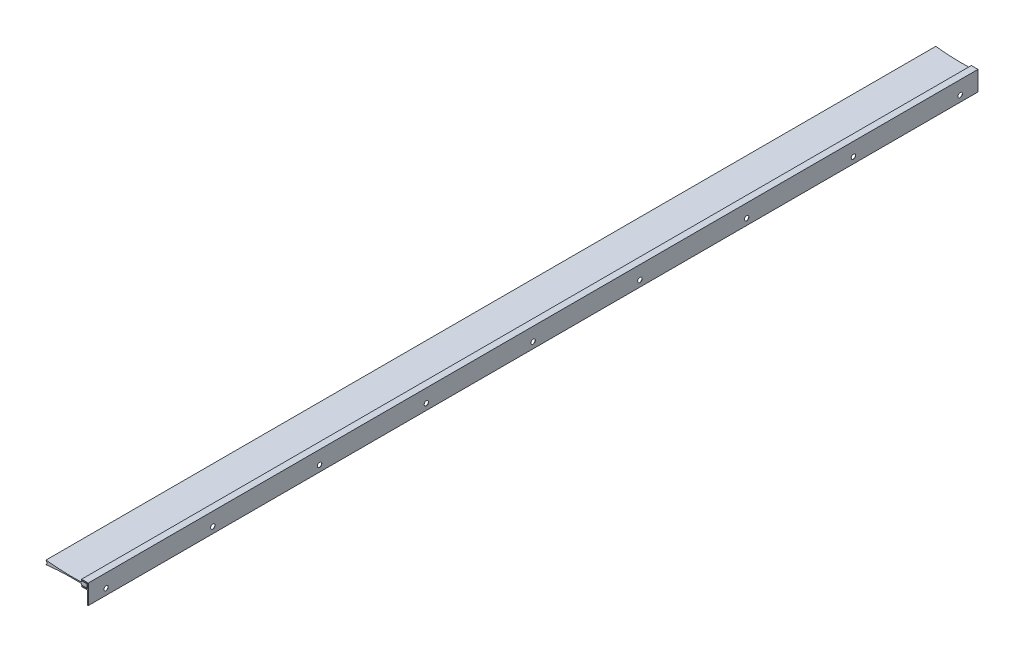
ISO-10303-21;
HEADER;
FILE_DESCRIPTION(('STEP AP214'),'2;1');
FILE_NAME('part.step','',(''),(''),'','','');
FILE_SCHEMA(('AUTOMOTIVE_DESIGN { 1 0 10303 214 1 1 1 1 }'));
ENDSEC;
DATA;
#1=APPLICATION_CONTEXT('core data for automotive mechanical design processes');
#2=APPLICATION_PROTOCOL_DEFINITION('international standard','automotive_design',2000,#1);
#3=PRODUCT_CONTEXT('',#1,'mechanical');
#4=PRODUCT('Part','Part','',(#3));
#5=PRODUCT_RELATED_PRODUCT_CATEGORY('part','',(#4));
#6=PRODUCT_DEFINITION_FORMATION('','',#4);
#7=PRODUCT_DEFINITION_CONTEXT('part definition',#1,'design');
#8=PRODUCT_DEFINITION('design','',#6,#7);
#9=PRODUCT_DEFINITION_SHAPE('','',#8);
#10=(LENGTH_UNIT() NAMED_UNIT(*) SI_UNIT(.MILLI.,.METRE.));
#11=(NAMED_UNIT(*) PLANE_ANGLE_UNIT() SI_UNIT($,.RADIAN.));
#12=(NAMED_UNIT(*) SI_UNIT($,.STERADIAN.) SOLID_ANGLE_UNIT());
#13=UNCERTAINTY_MEASURE_WITH_UNIT(LENGTH_MEASURE(1.E-05),#10,'distance_accuracy_value','');
#14=(GEOMETRIC_REPRESENTATION_CONTEXT(3) GLOBAL_UNCERTAINTY_ASSIGNED_CONTEXT((#13)) GLOBAL_UNIT_ASSIGNED_CONTEXT((#10,
#11,#12)) REPRESENTATION_CONTEXT('',''));
#15=CARTESIAN_POINT('',(0.,0.,0.));
#16=DIRECTION('',(0.,0.,1.));
#17=DIRECTION('',(1.,0.,0.));
#18=AXIS2_PLACEMENT_3D('',#15,#16,#17);
#19=CARTESIAN_POINT('',(0.,0.,-500.));
#20=DIRECTION('',(0.,0.,-1.));
#21=DIRECTION('',(-1.,0.,0.));
#22=AXIS2_PLACEMENT_3D('',#19,#20,#21);
#23=PLANE('',#22);
#24=DIRECTION('',(0.,-1.,0.));
#25=VECTOR('',#24,1.);
#26=CARTESIAN_POINT('',(0.,5.7,-500.));
#27=LINE('',#26,#25);
#28=CARTESIAN_POINT('',(0.,5.7,-500.));
#29=VERTEX_POINT('',#28);
#30=CARTESIAN_POINT('',(0.,4.29999999999997,-500.));
#31=VERTEX_POINT('',#30);
#32=EDGE_CURVE('E58',#29,#31,#27,.T.);
#33=ORIENTED_EDGE('',*,*,#32,.F.);
#34=DIRECTION('',(-1.,0.,0.));
#35=VECTOR('',#34,1.);
#36=CARTESIAN_POINT('',(0.,5.7,-500.));
#37=LINE('',#36,#35);
#38=CARTESIAN_POINT('',(6.,5.7,-500.));
#39=VERTEX_POINT('',#38);
#40=EDGE_CURVE('E150',#39,#29,#37,.T.);
#41=ORIENTED_EDGE('',*,*,#40,.F.);
#42=DIRECTION('',(0.,1.,0.));
#43=VECTOR('',#42,1.);
#44=CARTESIAN_POINT('',(6.,5.7,-500.));
#45=LINE('',#44,#43);
#46=CARTESIAN_POINT('',(6.,1.5,-500.));
#47=VERTEX_POINT('',#46);
#48=EDGE_CURVE('E154',#47,#39,#45,.T.);
#49=ORIENTED_EDGE('',*,*,#48,.F.);
#50=DIRECTION('',(1.,0.,0.));
#51=VECTOR('',#50,1.);
#52=CARTESIAN_POINT('',(0.,1.5,-500.));
#53=LINE('',#52,#51);
#54=CARTESIAN_POINT('',(0.,1.5,-500.));
#55=VERTEX_POINT('',#54);
#56=EDGE_CURVE('E158',#55,#47,#53,.T.);
#57=ORIENTED_EDGE('',*,*,#56,.F.);
#58=DIRECTION('',(0.,-1.,0.));
#59=VECTOR('',#58,1.);
#60=CARTESIAN_POINT('',(0.,2.9,-500.));
#61=LINE('',#60,#59);
#62=CARTESIAN_POINT('',(0.,2.90000000000001,-500.));
#63=VERTEX_POINT('',#62);
#64=EDGE_CURVE('E162',#63,#55,#61,.T.);
#65=ORIENTED_EDGE('',*,*,#64,.F.);
#66=CARTESIAN_POINT('',(-10.014858939479,-256.907048788947,-500.));
#67=DIRECTION('',(0.,0.,-1.));
#68=DIRECTION('',(-1.,0.,0.));
#69=AXIS2_PLACEMENT_3D('',#66,#67,#68);
#70=CIRCLE('',#69,260.);
#71=CARTESIAN_POINT('',(-40.,1.3581082020428,-500.));
#72=VERTEX_POINT('',#71);
#73=EDGE_CURVE('E166',#72,#63,#70,.T.);
#74=ORIENTED_EDGE('',*,*,#73,.F.);
#75=DIRECTION('',(-0.556086767877966,-0.831124242572094,0.));
#76=VECTOR('',#75,1.);
#77=CARTESIAN_POINT('',(-38.5,3.59999999999999,-500.));
#78=LINE('',#77,#76);
#79=CARTESIAN_POINT('',(-38.5,3.59999999999999,-500.));
#80=VERTEX_POINT('',#79);
#81=EDGE_CURVE('E96',#80,#72,#78,.T.);
#82=ORIENTED_EDGE('',*,*,#81,.F.);
#83=DIRECTION('',(0.556086767877967,-0.831124242572094,0.));
#84=VECTOR('',#83,1.);
#85=CARTESIAN_POINT('',(-40.,5.84189179795719,-500.));
#86=LINE('',#85,#84);
#87=CARTESIAN_POINT('',(-40.,5.84189179795719,-500.));
#88=VERTEX_POINT('',#87);
#89=EDGE_CURVE('E101',#88,#80,#86,.T.);
#90=ORIENTED_EDGE('',*,*,#89,.F.);
#91=CARTESIAN_POINT('',(-10.014858939479,264.107048788947,-500.));
#92=DIRECTION('',(0.,0.,-1.));
#93=DIRECTION('',(-1.,0.,0.));
#94=AXIS2_PLACEMENT_3D('',#91,#92,#93);
#95=CIRCLE('',#94,260.);
#96=EDGE_CURVE('E131',#31,#88,#95,.T.);
#97=ORIENTED_EDGE('',*,*,#96,.F.);
#98=EDGE_LOOP('',(#33,#41,#49,#57,#65,#74,#82,#90,#97));
#99=FACE_BOUND('',#98,.T.);
#100=ADVANCED_FACE('F50',(#99),#23,.T.);
#101=CARTESIAN_POINT('',(-10.014858939479,264.107048788947,500.));
#102=DIRECTION('',(0.,0.,-1.));
#103=DIRECTION('',(-1.,0.,0.));
#104=AXIS2_PLACEMENT_3D('',#101,#102,#103);
#105=PLANE('',#104);
#106=DIRECTION('',(0.,-1.,0.));
#107=VECTOR('',#106,1.);
#108=CARTESIAN_POINT('',(0.,5.7,500.));
#109=LINE('',#108,#107);
#110=CARTESIAN_POINT('',(0.,5.7,500.));
#111=VERTEX_POINT('',#110);
#112=CARTESIAN_POINT('',(0.,4.29999999999997,500.));
#113=VERTEX_POINT('',#112);
#114=EDGE_CURVE('E141',#111,#113,#109,.T.);
#115=ORIENTED_EDGE('',*,*,#114,.T.);
#116=CARTESIAN_POINT('',(-10.014858939479,264.107048788947,500.));
#117=DIRECTION('',(0.,0.,-1.));
#118=DIRECTION('',(-1.,0.,0.));
#119=AXIS2_PLACEMENT_3D('',#116,#117,#118);
#120=CIRCLE('',#119,260.);
#121=CARTESIAN_POINT('',(-40.,5.84189179795719,500.));
#122=VERTEX_POINT('',#121);
#123=EDGE_CURVE('E129',#113,#122,#120,.T.);
#124=ORIENTED_EDGE('',*,*,#123,.T.);
#125=DIRECTION('',(0.556086767877967,-0.831124242572094,0.));
#126=VECTOR('',#125,1.);
#127=CARTESIAN_POINT('',(-40.,5.84189179795719,500.));
#128=LINE('',#127,#126);
#129=CARTESIAN_POINT('',(-38.5,3.59999999999999,500.));
#130=VERTEX_POINT('',#129);
#131=EDGE_CURVE('E133',#122,#130,#128,.T.);
#132=ORIENTED_EDGE('',*,*,#131,.T.);
#133=DIRECTION('',(-0.556086767877966,-0.831124242572094,0.));
#134=VECTOR('',#133,1.);
#135=CARTESIAN_POINT('',(-38.5,3.59999999999999,500.));
#136=LINE('',#135,#134);
#137=CARTESIAN_POINT('',(-40.,1.3581082020428,500.));
#138=VERTEX_POINT('',#137);
#139=EDGE_CURVE('E137',#130,#138,#136,.T.);
#140=ORIENTED_EDGE('',*,*,#139,.T.);
#141=CARTESIAN_POINT('',(-10.014858939479,-256.907048788947,500.));
#142=DIRECTION('',(0.,0.,-1.));
#143=DIRECTION('',(1.,0.,0.));
#144=AXIS2_PLACEMENT_3D('',#141,#142,#143);
#145=CIRCLE('',#144,260.);
#146=CARTESIAN_POINT('',(0.,2.9,500.));
#147=VERTEX_POINT('',#146);
#148=EDGE_CURVE('E184',#138,#147,#145,.T.);
#149=ORIENTED_EDGE('',*,*,#148,.T.);
#150=DIRECTION('',(0.,-1.,0.));
#151=VECTOR('',#150,1.);
#152=CARTESIAN_POINT('',(0.,2.9,500.));
#153=LINE('',#152,#151);
#154=CARTESIAN_POINT('',(0.,1.5,500.));
#155=VERTEX_POINT('',#154);
#156=EDGE_CURVE('E189',#147,#155,#153,.T.);
#157=ORIENTED_EDGE('',*,*,#156,.T.);
#158=DIRECTION('',(1.,0.,0.));
#159=VECTOR('',#158,1.);
#160=CARTESIAN_POINT('',(0.,1.5,500.));
#161=LINE('',#160,#159);
#162=CARTESIAN_POINT('',(6.,1.5,500.));
#163=VERTEX_POINT('',#162);
#164=EDGE_CURVE('E193',#155,#163,#161,.T.);
#165=ORIENTED_EDGE('',*,*,#164,.T.);
#166=DIRECTION('',(0.,1.,0.));
#167=VECTOR('',#166,1.);
#168=CARTESIAN_POINT('',(6.,5.7,500.));
#169=LINE('',#168,#167);
#170=CARTESIAN_POINT('',(6.,5.7,500.));
#171=VERTEX_POINT('',#170);
#172=EDGE_CURVE('E196',#163,#171,#169,.T.);
#173=ORIENTED_EDGE('',*,*,#172,.T.);
#174=DIRECTION('',(-1.,0.,0.));
#175=VECTOR('',#174,1.);
#176=CARTESIAN_POINT('',(0.,5.7,500.));
#177=LINE('',#176,#175);
#178=EDGE_CURVE('E147',#171,#111,#177,.T.);
#179=ORIENTED_EDGE('',*,*,#178,.T.);
#180=EDGE_LOOP('',(#115,#124,#132,#140,#149,#157,#165,#173,#179));
#181=FACE_BOUND('',#180,.T.);
#182=ADVANCED_FACE('F139',(#181),#105,.F.);
#183=CARTESIAN_POINT('',(-10.014858939479,264.107048788947,-546.218008560895));
#184=DIRECTION('',(0.,0.,1.));
#185=DIRECTION('',(1.,0.,0.));
#186=AXIS2_PLACEMENT_3D('',#183,#184,#185);
#187=CYLINDRICAL_SURFACE('',#186,260.);
#188=DIRECTION('',(0.,0.,1.));
#189=VECTOR('',#188,1.);
#190=CARTESIAN_POINT('',(0.,4.29999999999997,-546.218008560895));
#191=LINE('',#190,#189);
#192=EDGE_CURVE('E12',#31,#113,#191,.T.);
#193=ORIENTED_EDGE('',*,*,#192,.F.);
#194=ORIENTED_EDGE('',*,*,#96,.T.);
#195=DIRECTION('',(0.,0.,1.));
#196=VECTOR('',#195,1.);
#197=CARTESIAN_POINT('',(-40.,5.84189179795719,-546.218008560895));
#198=LINE('',#197,#196);
#199=EDGE_CURVE('E126',#88,#122,#198,.T.);
#200=ORIENTED_EDGE('',*,*,#199,.T.);
#201=ORIENTED_EDGE('',*,*,#123,.F.);
#202=EDGE_LOOP('',(#193,#194,#200,#201));
#203=FACE_BOUND('',#202,.T.);
#204=ADVANCED_FACE('F127',(#203),#187,.F.);
#205=CARTESIAN_POINT('',(-40.,5.84189179795719,-546.218008560895));
#206=DIRECTION('',(-0.831124242572094,-0.556086767877967,0.));
#207=DIRECTION('',(0.556086767877967,-0.831124242572094,0.));
#208=AXIS2_PLACEMENT_3D('',#205,#206,#207);
#209=PLANE('',#208);
#210=ORIENTED_EDGE('',*,*,#199,.F.);
#211=ORIENTED_EDGE('',*,*,#89,.T.);
#212=DIRECTION('',(0.,0.,1.));
#213=VECTOR('',#212,1.);
#214=CARTESIAN_POINT('',(-38.5,3.59999999999999,-546.218008560895));
#215=LINE('',#214,#213);
#216=EDGE_CURVE('E121',#80,#130,#215,.T.);
#217=ORIENTED_EDGE('',*,*,#216,.T.);
#218=ORIENTED_EDGE('',*,*,#131,.F.);
#219=EDGE_LOOP('',(#210,#211,#217,#218));
#220=FACE_BOUND('',#219,.T.);
#221=ADVANCED_FACE('F134',(#220),#209,.T.);
#222=CARTESIAN_POINT('',(-38.5,3.59999999999999,-546.218008560895));
#223=DIRECTION('',(-0.831124242572094,0.556086767877966,0.));
#224=DIRECTION('',(-0.556086767877966,-0.831124242572094,0.));
#225=AXIS2_PLACEMENT_3D('',#222,#223,#224);
#226=PLANE('',#225);
#227=ORIENTED_EDGE('',*,*,#216,.F.);
#228=ORIENTED_EDGE('',*,*,#81,.T.);
#229=DIRECTION('',(0.,0.,1.));
#230=VECTOR('',#229,1.);
#231=CARTESIAN_POINT('',(-40.,1.3581082020428,-546.218008560895));
#232=LINE('',#231,#230);
#233=EDGE_CURVE('E169',#72,#138,#232,.T.);
#234=ORIENTED_EDGE('',*,*,#233,.T.);
#235=ORIENTED_EDGE('',*,*,#139,.F.);
#236=EDGE_LOOP('',(#227,#228,#234,#235));
#237=FACE_BOUND('',#236,.T.);
#238=ADVANCED_FACE('F181',(#237),#226,.T.);
#239=CARTESIAN_POINT('',(-10.014858939479,-256.907048788947,-546.218008560895));
#240=DIRECTION('',(0.,0.,1.));
#241=DIRECTION('',(1.,0.,0.));
#242=AXIS2_PLACEMENT_3D('',#239,#240,#241);
#243=CYLINDRICAL_SURFACE('',#242,260.);
#244=ORIENTED_EDGE('',*,*,#233,.F.);
#245=ORIENTED_EDGE('',*,*,#73,.T.);
#246=DIRECTION('',(0.,0.,1.));
#247=VECTOR('',#246,1.);
#248=CARTESIAN_POINT('',(0.,2.9,-546.218008560895));
#249=LINE('',#248,#247);
#250=EDGE_CURVE('E165',#63,#147,#249,.T.);
#251=ORIENTED_EDGE('',*,*,#250,.T.);
#252=ORIENTED_EDGE('',*,*,#148,.F.);
#253=EDGE_LOOP('',(#244,#245,#251,#252));
#254=FACE_BOUND('',#253,.T.);
#255=ADVANCED_FACE('F185',(#254),#243,.F.);
#256=CARTESIAN_POINT('',(0.,2.9,-546.218008560895));
#257=DIRECTION('',(-1.,0.,0.));
#258=DIRECTION('',(0.,-1.,0.));
#259=AXIS2_PLACEMENT_3D('',#256,#257,#258);
#260=PLANE('',#259);
#261=ORIENTED_EDGE('',*,*,#250,.F.);
#262=ORIENTED_EDGE('',*,*,#64,.T.);
#263=DIRECTION('',(0.,0.,1.));
#264=VECTOR('',#263,1.);
#265=CARTESIAN_POINT('',(0.,1.5,-546.218008560895));
#266=LINE('',#265,#264);
#267=EDGE_CURVE('E161',#55,#155,#266,.T.);
#268=ORIENTED_EDGE('',*,*,#267,.T.);
#269=ORIENTED_EDGE('',*,*,#156,.F.);
#270=EDGE_LOOP('',(#261,#262,#268,#269));
#271=FACE_BOUND('',#270,.T.);
#272=ADVANCED_FACE('F225',(#271),#260,.T.);
#273=CARTESIAN_POINT('',(0.,1.5,-546.218008560895));
#274=DIRECTION('',(0.,-1.,0.));
#275=DIRECTION('',(0.,0.,-1.));
#276=AXIS2_PLACEMENT_3D('',#273,#274,#275);
#277=PLANE('',#276);
#278=ORIENTED_EDGE('',*,*,#267,.F.);
#279=ORIENTED_EDGE('',*,*,#56,.T.);
#280=DIRECTION('',(0.,0.,1.));
#281=VECTOR('',#280,1.);
#282=CARTESIAN_POINT('',(6.,1.5,-546.218008560895));
#283=LINE('',#282,#281);
#284=EDGE_CURVE('E157',#47,#163,#283,.T.);
#285=ORIENTED_EDGE('',*,*,#284,.T.);
#286=ORIENTED_EDGE('',*,*,#164,.F.);
#287=EDGE_LOOP('',(#278,#279,#285,#286));
#288=FACE_BOUND('',#287,.T.);
#289=ADVANCED_FACE('F223',(#288),#277,.T.);
#290=CARTESIAN_POINT('',(6.,5.7,-546.218008560895));
#291=DIRECTION('',(1.,0.,0.));
#292=DIRECTION('',(0.,0.,-1.));
#293=AXIS2_PLACEMENT_3D('',#290,#291,#292);
#294=PLANE('',#293);
#295=ORIENTED_EDGE('',*,*,#284,.F.);
#296=ORIENTED_EDGE('',*,*,#48,.T.);
#297=DIRECTION('',(0.,0.,1.));
#298=VECTOR('',#297,1.);
#299=CARTESIAN_POINT('',(6.,5.7,-546.218008560895));
#300=LINE('',#299,#298);
#301=EDGE_CURVE('E153',#39,#171,#300,.T.);
#302=ORIENTED_EDGE('',*,*,#301,.T.);
#303=ORIENTED_EDGE('',*,*,#172,.F.);
#304=EDGE_LOOP('',(#295,#296,#302,#303));
#305=FACE_BOUND('',#304,.T.);
#306=ADVANCED_FACE('F211',(#305),#294,.T.);
#307=CARTESIAN_POINT('',(0.,5.7,-546.218008560895));
#308=DIRECTION('',(0.,1.,0.));
#309=DIRECTION('',(0.,0.,1.));
#310=AXIS2_PLACEMENT_3D('',#307,#308,#309);
#311=PLANE('',#310);
#312=ORIENTED_EDGE('',*,*,#301,.F.);
#313=ORIENTED_EDGE('',*,*,#40,.T.);
#314=DIRECTION('',(0.,0.,1.));
#315=VECTOR('',#314,1.);
#316=CARTESIAN_POINT('',(0.,5.7,-546.218008560895));
#317=LINE('',#316,#315);
#318=EDGE_CURVE('E149',#29,#111,#317,.T.);
#319=ORIENTED_EDGE('',*,*,#318,.T.);
#320=ORIENTED_EDGE('',*,*,#178,.F.);
#321=EDGE_LOOP('',(#312,#313,#319,#320));
#322=FACE_BOUND('',#321,.T.);
#323=ADVANCED_FACE('F203',(#322),#311,.T.);
#324=CARTESIAN_POINT('',(0.,5.7,-546.218008560895));
#325=DIRECTION('',(-1.,0.,0.));
#326=DIRECTION('',(0.,-1.,0.));
#327=AXIS2_PLACEMENT_3D('',#324,#325,#326);
#328=PLANE('',#327);
#329=ORIENTED_EDGE('',*,*,#318,.F.);
#330=ORIENTED_EDGE('',*,*,#32,.T.);
#331=ORIENTED_EDGE('',*,*,#192,.T.);
#332=ORIENTED_EDGE('',*,*,#114,.F.);
#333=EDGE_LOOP('',(#329,#330,#331,#332));
#334=FACE_BOUND('',#333,.T.);
#335=ADVANCED_FACE('F205',(#334),#328,.T.);
#336=CLOSED_SHELL('',(#100,#182,#204,#221,#238,#255,#272,#289,#306,#323,#335));
#337=MANIFOLD_SOLID_BREP('B2',#336);
#338=CARTESIAN_POINT('',(0.,6.2,500.));
#339=DIRECTION('',(1.,0.,0.));
#340=DIRECTION('',(0.,0.,-1.));
#341=AXIS2_PLACEMENT_3D('',#338,#339,#340);
#342=PLANE('',#341);
#343=DIRECTION('',(0.,-1.,0.));
#344=VECTOR('',#343,1.);
#345=CARTESIAN_POINT('',(0.,6.2,-500.));
#346=LINE('',#345,#344);
#347=CARTESIAN_POINT('',(0.,7.2,-500.));
#348=VERTEX_POINT('',#347);
#349=CARTESIAN_POINT('',(0.,6.2,-500.));
#350=VERTEX_POINT('',#349);
#351=EDGE_CURVE('E455',#348,#350,#346,.T.);
#352=ORIENTED_EDGE('',*,*,#351,.T.);
#353=DIRECTION('',(0.,0.,-1.));
#354=VECTOR('',#353,1.);
#355=CARTESIAN_POINT('',(0.,6.2,500.));
#356=LINE('',#355,#354);
#357=CARTESIAN_POINT('',(0.,6.2,500.));
#358=VERTEX_POINT('',#357);
#359=EDGE_CURVE('E48',#358,#350,#356,.T.);
#360=ORIENTED_EDGE('',*,*,#359,.F.);
#361=DIRECTION('',(0.,-1.,0.));
#362=VECTOR('',#361,1.);
#363=CARTESIAN_POINT('',(0.,6.2,500.));
#364=LINE('',#363,#362);
#365=CARTESIAN_POINT('',(0.,7.2,500.));
#366=VERTEX_POINT('',#365);
#367=EDGE_CURVE('E474',#366,#358,#364,.T.);
#368=ORIENTED_EDGE('',*,*,#367,.F.);
#369=DIRECTION('',(0.,0.,-1.));
#370=VECTOR('',#369,1.);
#371=CARTESIAN_POINT('',(0.,7.2,500.));
#372=LINE('',#371,#370);
#373=EDGE_CURVE('E451',#366,#348,#372,.T.);
#374=ORIENTED_EDGE('',*,*,#373,.T.);
#375=EDGE_LOOP('',(#352,#360,#368,#374));
#376=FACE_BOUND('',#375,.T.);
#377=ADVANCED_FACE('F347',(#376),#342,.F.);
#378=CARTESIAN_POINT('',(6.5,6.2,500.));
#379=DIRECTION('',(0.,1.,0.));
#380=DIRECTION('',(-1.,0.,0.));
#381=AXIS2_PLACEMENT_3D('',#378,#379,#380);
#382=PLANE('',#381);
#383=DIRECTION('',(1.,0.,0.));
#384=VECTOR('',#383,1.);
#385=CARTESIAN_POINT('',(6.5,6.2,-500.));
#386=LINE('',#385,#384);
#387=CARTESIAN_POINT('',(6.5,6.2,-500.));
#388=VERTEX_POINT('',#387);
#389=EDGE_CURVE('E458',#350,#388,#386,.T.);
#390=ORIENTED_EDGE('',*,*,#389,.T.);
#391=DIRECTION('',(0.,0.,-1.));
#392=VECTOR('',#391,1.);
#393=CARTESIAN_POINT('',(6.5,6.2,500.));
#394=LINE('',#393,#392);
#395=CARTESIAN_POINT('',(6.5,6.2,500.));
#396=VERTEX_POINT('',#395);
#397=EDGE_CURVE('E355',#396,#388,#394,.T.);
#398=ORIENTED_EDGE('',*,*,#397,.F.);
#399=DIRECTION('',(1.,0.,0.));
#400=VECTOR('',#399,1.);
#401=CARTESIAN_POINT('',(6.5,6.2,500.));
#402=LINE('',#401,#400);
#403=EDGE_CURVE('E412',#358,#396,#402,.T.);
#404=ORIENTED_EDGE('',*,*,#403,.F.);
#405=ORIENTED_EDGE('',*,*,#359,.T.);
#406=EDGE_LOOP('',(#390,#398,#404,#405));
#407=FACE_BOUND('',#406,.T.);
#408=ADVANCED_FACE('F607',(#407),#382,.F.);
#409=CARTESIAN_POINT('',(6.5,1.,500.));
#410=DIRECTION('',(1.,0.,0.));
#411=DIRECTION('',(0.,0.,-1.));
#412=AXIS2_PLACEMENT_3D('',#409,#410,#411);
#413=PLANE('',#412);
#414=DIRECTION('',(0.,-1.,0.));
#415=VECTOR('',#414,1.);
#416=CARTESIAN_POINT('',(6.5,1.,-500.));
#417=LINE('',#416,#415);
#418=CARTESIAN_POINT('',(6.5,1.,-500.));
#419=VERTEX_POINT('',#418);
#420=EDGE_CURVE('E461',#388,#419,#417,.T.);
#421=ORIENTED_EDGE('',*,*,#420,.T.);
#422=DIRECTION('',(0.,0.,-1.));
#423=VECTOR('',#422,1.);
#424=CARTESIAN_POINT('',(6.5,1.,500.));
#425=LINE('',#424,#423);
#426=CARTESIAN_POINT('',(6.5,1.,500.));
#427=VERTEX_POINT('',#426);
#428=EDGE_CURVE('E487',#427,#419,#425,.T.);
#429=ORIENTED_EDGE('',*,*,#428,.F.);
#430=DIRECTION('',(0.,-1.,0.));
#431=VECTOR('',#430,1.);
#432=CARTESIAN_POINT('',(6.5,1.,500.));
#433=LINE('',#432,#431);
#434=EDGE_CURVE('E495',#396,#427,#433,.T.);
#435=ORIENTED_EDGE('',*,*,#434,.F.);
#436=ORIENTED_EDGE('',*,*,#397,.T.);
#437=EDGE_LOOP('',(#421,#429,#435,#436));
#438=FACE_BOUND('',#437,.T.);
#439=ADVANCED_FACE('F493',(#438),#413,.F.);
#440=CARTESIAN_POINT('',(0.,1.,500.));
#441=DIRECTION('',(0.,-1.,0.));
#442=DIRECTION('',(0.,0.,-1.));
#443=AXIS2_PLACEMENT_3D('',#440,#441,#442);
#444=PLANE('',#443);
#445=DIRECTION('',(-1.,0.,0.));
#446=VECTOR('',#445,1.);
#447=CARTESIAN_POINT('',(0.,1.,-500.));
#448=LINE('',#447,#446);
#449=CARTESIAN_POINT('',(0.,1.,-500.));
#450=VERTEX_POINT('',#449);
#451=EDGE_CURVE('E463',#419,#450,#448,.T.);
#452=ORIENTED_EDGE('',*,*,#451,.T.);
#453=DIRECTION('',(0.,0.,-1.));
#454=VECTOR('',#453,1.);
#455=CARTESIAN_POINT('',(0.,1.,500.));
#456=LINE('',#455,#454);
#457=CARTESIAN_POINT('',(0.,1.,500.));
#458=VERTEX_POINT('',#457);
#459=EDGE_CURVE('E484',#458,#450,#456,.T.);
#460=ORIENTED_EDGE('',*,*,#459,.F.);
#461=DIRECTION('',(-1.,0.,0.));
#462=VECTOR('',#461,1.);
#463=CARTESIAN_POINT('',(0.,1.,500.));
#464=LINE('',#463,#462);
#465=EDGE_CURVE('E513',#427,#458,#464,.T.);
#466=ORIENTED_EDGE('',*,*,#465,.F.);
#467=ORIENTED_EDGE('',*,*,#428,.T.);
#468=EDGE_LOOP('',(#452,#460,#466,#467));
#469=FACE_BOUND('',#468,.T.);
#470=ADVANCED_FACE('F504',(#469),#444,.F.);
#471=CARTESIAN_POINT('',(0.,0.,500.));
#472=DIRECTION('',(1.,0.,0.));
#473=DIRECTION('',(0.,0.,-1.));
#474=AXIS2_PLACEMENT_3D('',#471,#472,#473);
#475=PLANE('',#474);
#476=DIRECTION('',(0.,-1.,0.));
#477=VECTOR('',#476,1.);
#478=CARTESIAN_POINT('',(0.,0.,-500.));
#479=LINE('',#478,#477);
#480=CARTESIAN_POINT('',(0.,0.,-500.));
#481=VERTEX_POINT('',#480);
#482=EDGE_CURVE('E465',#450,#481,#479,.T.);
#483=ORIENTED_EDGE('',*,*,#482,.T.);
#484=DIRECTION('',(0.,0.,-1.));
#485=VECTOR('',#484,1.);
#486=CARTESIAN_POINT('',(0.,0.,500.));
#487=LINE('',#486,#485);
#488=CARTESIAN_POINT('',(0.,0.,500.));
#489=VERTEX_POINT('',#488);
#490=EDGE_CURVE('E481',#489,#481,#487,.T.);
#491=ORIENTED_EDGE('',*,*,#490,.F.);
#492=DIRECTION('',(0.,-1.,0.));
#493=VECTOR('',#492,1.);
#494=CARTESIAN_POINT('',(0.,0.,500.));
#495=LINE('',#494,#493);
#496=EDGE_CURVE('E510',#458,#489,#495,.T.);
#497=ORIENTED_EDGE('',*,*,#496,.F.);
#498=ORIENTED_EDGE('',*,*,#459,.T.);
#499=EDGE_LOOP('',(#483,#491,#497,#498));
#500=FACE_BOUND('',#499,.T.);
#501=ADVANCED_FACE('F508',(#500),#475,.F.);
#502=CARTESIAN_POINT('',(6.5,0.,500.));
#503=DIRECTION('',(0.,1.,0.));
#504=DIRECTION('',(-1.,0.,0.));
#505=AXIS2_PLACEMENT_3D('',#502,#503,#504);
#506=PLANE('',#505);
#507=DIRECTION('',(1.,0.,0.));
#508=VECTOR('',#507,1.);
#509=CARTESIAN_POINT('',(6.5,0.,-500.));
#510=LINE('',#509,#508);
#511=CARTESIAN_POINT('',(6.5,0.,-500.));
#512=VERTEX_POINT('',#511);
#513=EDGE_CURVE('E467',#481,#512,#510,.T.);
#514=ORIENTED_EDGE('',*,*,#513,.T.);
#515=DIRECTION('',(0.,0.,-1.));
#516=VECTOR('',#515,1.);
#517=CARTESIAN_POINT('',(6.5,0.,500.));
#518=LINE('',#517,#516);
#519=CARTESIAN_POINT('',(6.5,0.,500.));
#520=VERTEX_POINT('',#519);
#521=EDGE_CURVE('E478',#520,#512,#518,.T.);
#522=ORIENTED_EDGE('',*,*,#521,.F.);
#523=DIRECTION('',(1.,0.,0.));
#524=VECTOR('',#523,1.);
#525=CARTESIAN_POINT('',(6.5,0.,500.));
#526=LINE('',#525,#524);
#527=EDGE_CURVE('E512',#489,#520,#526,.T.);
#528=ORIENTED_EDGE('',*,*,#527,.F.);
#529=ORIENTED_EDGE('',*,*,#490,.T.);
#530=EDGE_LOOP('',(#514,#522,#528,#529));
#531=FACE_BOUND('',#530,.T.);
#532=ADVANCED_FACE('F581',(#531),#506,.F.);
#533=CARTESIAN_POINT('',(6.5,-14.8,500.));
#534=DIRECTION('',(1.,0.,0.));
#535=DIRECTION('',(0.,1.,0.));
#536=AXIS2_PLACEMENT_3D('',#533,#534,#535);
#537=PLANE('',#536);
#538=CARTESIAN_POINT('',(6.5,-7.8,480.));
#539=DIRECTION('',(-1.,0.,0.));
#540=DIRECTION('',(0.,0.,1.));
#541=AXIS2_PLACEMENT_3D('',#538,#539,#540);
#542=CIRCLE('',#541,3.47);
#543=CARTESIAN_POINT('',(6.5,-7.8,483.47));
#544=VERTEX_POINT('',#543);
#545=EDGE_CURVE('E537',#544,#544,#542,.T.);
#546=ORIENTED_EDGE('',*,*,#545,.F.);
#547=EDGE_LOOP('',(#546));
#548=FACE_BOUND('',#547,.T.);
#549=CARTESIAN_POINT('',(6.5,-7.8,360.));
#550=DIRECTION('',(-1.,0.,0.));
#551=DIRECTION('',(0.,0.,1.));
#552=AXIS2_PLACEMENT_3D('',#549,#550,#551);
#553=CIRCLE('',#552,3.47);
#554=CARTESIAN_POINT('',(6.5,-7.8,363.47));
#555=VERTEX_POINT('',#554);
#556=EDGE_CURVE('E536',#555,#555,#553,.T.);
#557=ORIENTED_EDGE('',*,*,#556,.F.);
#558=EDGE_LOOP('',(#557));
#559=FACE_BOUND('',#558,.T.);
#560=CARTESIAN_POINT('',(6.5,-7.8,-240.));
#561=DIRECTION('',(-1.,0.,0.));
#562=DIRECTION('',(0.,0.,1.));
#563=AXIS2_PLACEMENT_3D('',#560,#561,#562);
#564=CIRCLE('',#563,3.47);
#565=CARTESIAN_POINT('',(6.5,-7.8,-236.53));
#566=VERTEX_POINT('',#565);
#567=EDGE_CURVE('E557',#566,#566,#564,.T.);
#568=ORIENTED_EDGE('',*,*,#567,.F.);
#569=EDGE_LOOP('',(#568));
#570=FACE_BOUND('',#569,.T.);
#571=CARTESIAN_POINT('',(6.5,-7.8,-360.));
#572=DIRECTION('',(-1.,0.,0.));
#573=DIRECTION('',(0.,0.,1.));
#574=AXIS2_PLACEMENT_3D('',#571,#572,#573);
#575=CIRCLE('',#574,3.47);
#576=CARTESIAN_POINT('',(6.5,-7.8,-356.53));
#577=VERTEX_POINT('',#576);
#578=EDGE_CURVE('E549',#577,#577,#575,.T.);
#579=ORIENTED_EDGE('',*,*,#578,.F.);
#580=EDGE_LOOP('',(#579));
#581=FACE_BOUND('',#580,.T.);
#582=CARTESIAN_POINT('',(6.5,-7.8,-480.));
#583=DIRECTION('',(-1.,0.,0.));
#584=DIRECTION('',(0.,0.,1.));
#585=AXIS2_PLACEMENT_3D('',#582,#583,#584);
#586=CIRCLE('',#585,3.47);
#587=CARTESIAN_POINT('',(6.5,-7.8,-476.53));
#588=VERTEX_POINT('',#587);
#589=EDGE_CURVE('E550',#588,#588,#586,.T.);
#590=ORIENTED_EDGE('',*,*,#589,.F.);
#591=EDGE_LOOP('',(#590));
#592=FACE_BOUND('',#591,.T.);
#593=CARTESIAN_POINT('',(6.5,-7.8,120.));
#594=DIRECTION('',(-1.,0.,0.));
#595=DIRECTION('',(0.,0.,1.));
#596=AXIS2_PLACEMENT_3D('',#593,#594,#595);
#597=CIRCLE('',#596,3.47);
#598=CARTESIAN_POINT('',(6.5,-7.8,123.47));
#599=VERTEX_POINT('',#598);
#600=EDGE_CURVE('E567',#599,#599,#597,.T.);
#601=ORIENTED_EDGE('',*,*,#600,.F.);
#602=EDGE_LOOP('',(#601));
#603=FACE_BOUND('',#602,.T.);
#604=CARTESIAN_POINT('',(6.5,-7.8,240.));
#605=DIRECTION('',(-1.,0.,0.));
#606=DIRECTION('',(0.,0.,1.));
#607=AXIS2_PLACEMENT_3D('',#604,#605,#606);
#608=CIRCLE('',#607,3.47);
#609=CARTESIAN_POINT('',(6.5,-7.8,243.47));
#610=VERTEX_POINT('',#609);
#611=EDGE_CURVE('E543',#610,#610,#608,.T.);
#612=ORIENTED_EDGE('',*,*,#611,.F.);
#613=EDGE_LOOP('',(#612));
#614=FACE_BOUND('',#613,.T.);
#615=CARTESIAN_POINT('',(6.5,-7.8,-120.));
#616=DIRECTION('',(-1.,0.,0.));
#617=DIRECTION('',(0.,0.,1.));
#618=AXIS2_PLACEMENT_3D('',#615,#616,#617);
#619=CIRCLE('',#618,3.47);
#620=CARTESIAN_POINT('',(6.5,-7.8,-116.53));
#621=VERTEX_POINT('',#620);
#622=EDGE_CURVE('E529',#621,#621,#619,.T.);
#623=ORIENTED_EDGE('',*,*,#622,.F.);
#624=EDGE_LOOP('',(#623));
#625=FACE_BOUND('',#624,.T.);
#626=CARTESIAN_POINT('',(6.5,-7.8,0.));
#627=DIRECTION('',(-1.,0.,0.));
#628=DIRECTION('',(0.,0.,1.));
#629=AXIS2_PLACEMENT_3D('',#626,#627,#628);
#630=CIRCLE('',#629,3.47);
#631=CARTESIAN_POINT('',(6.5,-7.8,3.47));
#632=VERTEX_POINT('',#631);
#633=EDGE_CURVE('E523',#632,#632,#630,.T.);
#634=ORIENTED_EDGE('',*,*,#633,.F.);
#635=EDGE_LOOP('',(#634));
#636=FACE_BOUND('',#635,.T.);
#637=DIRECTION('',(0.,-1.,0.));
#638=VECTOR('',#637,1.);
#639=CARTESIAN_POINT('',(6.5,-14.8,-500.));
#640=LINE('',#639,#638);
#641=CARTESIAN_POINT('',(6.5,-14.8,-500.));
#642=VERTEX_POINT('',#641);
#643=EDGE_CURVE('E469',#512,#642,#640,.T.);
#644=ORIENTED_EDGE('',*,*,#643,.T.);
#645=DIRECTION('',(0.,0.,-1.));
#646=VECTOR('',#645,1.);
#647=CARTESIAN_POINT('',(6.5,-14.8,500.));
#648=LINE('',#647,#646);
#649=CARTESIAN_POINT('',(6.5,-14.8,500.));
#650=VERTEX_POINT('',#649);
#651=EDGE_CURVE('E446',#650,#642,#648,.T.);
#652=ORIENTED_EDGE('',*,*,#651,.F.);
#653=DIRECTION('',(0.,-1.,0.));
#654=VECTOR('',#653,1.);
#655=CARTESIAN_POINT('',(6.5,-14.8,500.));
#656=LINE('',#655,#654);
#657=EDGE_CURVE('E437',#520,#650,#656,.T.);
#658=ORIENTED_EDGE('',*,*,#657,.F.);
#659=ORIENTED_EDGE('',*,*,#521,.T.);
#660=EDGE_LOOP('',(#644,#652,#658,#659));
#661=FACE_BOUND('',#660,.T.);
#662=ADVANCED_FACE('F578',(#548,#559,#570,#581,#592,#603,#614,#625,#636,#661),#537,.F.);
#663=CARTESIAN_POINT('',(7.5,-14.8,500.));
#664=DIRECTION('',(0.,1.,0.));
#665=DIRECTION('',(0.,0.,1.));
#666=AXIS2_PLACEMENT_3D('',#663,#664,#665);
#667=PLANE('',#666);
#668=DIRECTION('',(1.,0.,0.));
#669=VECTOR('',#668,1.);
#670=CARTESIAN_POINT('',(7.5,-14.8,-500.));
#671=LINE('',#670,#669);
#672=CARTESIAN_POINT('',(7.5,-14.8,-500.));
#673=VERTEX_POINT('',#672);
#674=EDGE_CURVE('E445',#642,#673,#671,.T.);
#675=ORIENTED_EDGE('',*,*,#674,.T.);
#676=DIRECTION('',(0.,0.,-1.));
#677=VECTOR('',#676,1.);
#678=CARTESIAN_POINT('',(7.5,-14.8,500.));
#679=LINE('',#678,#677);
#680=CARTESIAN_POINT('',(7.5,-14.8,500.));
#681=VERTEX_POINT('',#680);
#682=EDGE_CURVE('E442',#681,#673,#679,.T.);
#683=ORIENTED_EDGE('',*,*,#682,.F.);
#684=DIRECTION('',(1.,0.,0.));
#685=VECTOR('',#684,1.);
#686=CARTESIAN_POINT('',(7.5,-14.8,500.));
#687=LINE('',#686,#685);
#688=EDGE_CURVE('E431',#650,#681,#687,.T.);
#689=ORIENTED_EDGE('',*,*,#688,.F.);
#690=ORIENTED_EDGE('',*,*,#651,.T.);
#691=EDGE_LOOP('',(#675,#683,#689,#690));
#692=FACE_BOUND('',#691,.T.);
#693=ADVANCED_FACE('F443',(#692),#667,.F.);
#694=CARTESIAN_POINT('',(7.5,7.2,500.));
#695=DIRECTION('',(-1.,0.,0.));
#696=DIRECTION('',(0.,-1.,0.));
#697=AXIS2_PLACEMENT_3D('',#694,#695,#696);
#698=PLANE('',#697);
#699=CARTESIAN_POINT('',(7.5,-7.8,480.));
#700=DIRECTION('',(-1.,0.,0.));
#701=DIRECTION('',(0.,-1.,0.));
#702=AXIS2_PLACEMENT_3D('',#699,#700,#701);
#703=CIRCLE('',#702,2.47);
#704=CARTESIAN_POINT('',(7.5,-10.27,480.));
#705=VERTEX_POINT('',#704);
#706=EDGE_CURVE('E533',#705,#705,#703,.T.);
#707=ORIENTED_EDGE('',*,*,#706,.T.);
#708=EDGE_LOOP('',(#707));
#709=FACE_BOUND('',#708,.T.);
#710=CARTESIAN_POINT('',(7.5,-7.8,360.));
#711=DIRECTION('',(-1.,0.,0.));
#712=DIRECTION('',(0.,-1.,0.));
#713=AXIS2_PLACEMENT_3D('',#710,#711,#712);
#714=CIRCLE('',#713,2.47);
#715=CARTESIAN_POINT('',(7.5,-10.27,360.));
#716=VERTEX_POINT('',#715);
#717=EDGE_CURVE('E540',#716,#716,#714,.T.);
#718=ORIENTED_EDGE('',*,*,#717,.T.);
#719=EDGE_LOOP('',(#718));
#720=FACE_BOUND('',#719,.T.);
#721=CARTESIAN_POINT('',(7.5,-7.8,-240.));
#722=DIRECTION('',(-1.,0.,0.));
#723=DIRECTION('',(0.,-1.,0.));
#724=AXIS2_PLACEMENT_3D('',#721,#722,#723);
#725=CIRCLE('',#724,2.47);
#726=CARTESIAN_POINT('',(7.5,-10.27,-240.));
#727=VERTEX_POINT('',#726);
#728=EDGE_CURVE('E532',#727,#727,#725,.T.);
#729=ORIENTED_EDGE('',*,*,#728,.T.);
#730=EDGE_LOOP('',(#729));
#731=FACE_BOUND('',#730,.T.);
#732=CARTESIAN_POINT('',(7.5,-7.8,-360.));
#733=DIRECTION('',(-1.,0.,0.));
#734=DIRECTION('',(0.,-1.,0.));
#735=AXIS2_PLACEMENT_3D('',#732,#733,#734);
#736=CIRCLE('',#735,2.47);
#737=CARTESIAN_POINT('',(7.5,-10.27,-360.));
#738=VERTEX_POINT('',#737);
#739=EDGE_CURVE('E554',#738,#738,#736,.T.);
#740=ORIENTED_EDGE('',*,*,#739,.T.);
#741=EDGE_LOOP('',(#740));
#742=FACE_BOUND('',#741,.T.);
#743=CARTESIAN_POINT('',(7.5,-7.8,-480.));
#744=DIRECTION('',(-1.,0.,0.));
#745=DIRECTION('',(0.,-1.,0.));
#746=AXIS2_PLACEMENT_3D('',#743,#744,#745);
#747=CIRCLE('',#746,2.47);
#748=CARTESIAN_POINT('',(7.5,-10.27,-480.));
#749=VERTEX_POINT('',#748);
#750=EDGE_CURVE('E546',#749,#749,#747,.T.);
#751=ORIENTED_EDGE('',*,*,#750,.T.);
#752=EDGE_LOOP('',(#751));
#753=FACE_BOUND('',#752,.T.);
#754=CARTESIAN_POINT('',(7.5,-7.8,120.));
#755=DIRECTION('',(-1.,0.,0.));
#756=DIRECTION('',(0.,-1.,0.));
#757=AXIS2_PLACEMENT_3D('',#754,#755,#756);
#758=CIRCLE('',#757,2.47);
#759=CARTESIAN_POINT('',(7.5,-10.27,120.));
#760=VERTEX_POINT('',#759);
#761=EDGE_CURVE('E553',#760,#760,#758,.T.);
#762=ORIENTED_EDGE('',*,*,#761,.T.);
#763=EDGE_LOOP('',(#762));
#764=FACE_BOUND('',#763,.T.);
#765=CARTESIAN_POINT('',(7.5,-7.8,240.));
#766=DIRECTION('',(-1.,0.,0.));
#767=DIRECTION('',(0.,-1.,0.));
#768=AXIS2_PLACEMENT_3D('',#765,#766,#767);
#769=CIRCLE('',#768,2.47);
#770=CARTESIAN_POINT('',(7.5,-10.27,240.));
#771=VERTEX_POINT('',#770);
#772=EDGE_CURVE('E564',#771,#771,#769,.T.);
#773=ORIENTED_EDGE('',*,*,#772,.T.);
#774=EDGE_LOOP('',(#773));
#775=FACE_BOUND('',#774,.T.);
#776=CARTESIAN_POINT('',(7.5,-7.8,-120.));
#777=DIRECTION('',(-1.,0.,0.));
#778=DIRECTION('',(0.,-1.,0.));
#779=AXIS2_PLACEMENT_3D('',#776,#777,#778);
#780=CIRCLE('',#779,2.47);
#781=CARTESIAN_POINT('',(7.5,-10.27,-120.));
#782=VERTEX_POINT('',#781);
#783=EDGE_CURVE('E526',#782,#782,#780,.T.);
#784=ORIENTED_EDGE('',*,*,#783,.T.);
#785=EDGE_LOOP('',(#784));
#786=FACE_BOUND('',#785,.T.);
#787=CARTESIAN_POINT('',(7.5,-7.8,0.));
#788=DIRECTION('',(-1.,0.,0.));
#789=DIRECTION('',(0.,-1.,0.));
#790=AXIS2_PLACEMENT_3D('',#787,#788,#789);
#791=CIRCLE('',#790,2.47);
#792=CARTESIAN_POINT('',(7.5,-10.27,0.));
#793=VERTEX_POINT('',#792);
#794=EDGE_CURVE('E459',#793,#793,#791,.T.);
#795=ORIENTED_EDGE('',*,*,#794,.T.);
#796=EDGE_LOOP('',(#795));
#797=FACE_BOUND('',#796,.T.);
#798=DIRECTION('',(0.,1.,0.));
#799=VECTOR('',#798,1.);
#800=CARTESIAN_POINT('',(7.5,7.2,-500.));
#801=LINE('',#800,#799);
#802=CARTESIAN_POINT('',(7.5,7.2,-500.));
#803=VERTEX_POINT('',#802);
#804=EDGE_CURVE('E398',#673,#803,#801,.T.);
#805=ORIENTED_EDGE('',*,*,#804,.T.);
#806=DIRECTION('',(0.,0.,-1.));
#807=VECTOR('',#806,1.);
#808=CARTESIAN_POINT('',(7.5,7.2,500.));
#809=LINE('',#808,#807);
#810=CARTESIAN_POINT('',(7.5,7.2,500.));
#811=VERTEX_POINT('',#810);
#812=EDGE_CURVE('E447',#811,#803,#809,.T.);
#813=ORIENTED_EDGE('',*,*,#812,.F.);
#814=DIRECTION('',(0.,1.,0.));
#815=VECTOR('',#814,1.);
#816=CARTESIAN_POINT('',(7.5,7.2,500.));
#817=LINE('',#816,#815);
#818=EDGE_CURVE('E435',#681,#811,#817,.T.);
#819=ORIENTED_EDGE('',*,*,#818,.F.);
#820=ORIENTED_EDGE('',*,*,#682,.T.);
#821=EDGE_LOOP('',(#805,#813,#819,#820));
#822=FACE_BOUND('',#821,.T.);
#823=ADVANCED_FACE('F449',(#709,#720,#731,#742,#753,#764,#775,#786,#797,#822),#698,.F.);
#824=CARTESIAN_POINT('',(0.,7.2,500.));
#825=DIRECTION('',(0.,-1.,0.));
#826=DIRECTION('',(1.,0.,0.));
#827=AXIS2_PLACEMENT_3D('',#824,#825,#826);
#828=PLANE('',#827);
#829=DIRECTION('',(-1.,0.,0.));
#830=VECTOR('',#829,1.);
#831=CARTESIAN_POINT('',(0.,7.2,-500.));
#832=LINE('',#831,#830);
#833=EDGE_CURVE('E404',#803,#348,#832,.T.);
#834=ORIENTED_EDGE('',*,*,#833,.T.);
#835=ORIENTED_EDGE('',*,*,#373,.F.);
#836=DIRECTION('',(-1.,0.,0.));
#837=VECTOR('',#836,1.);
#838=CARTESIAN_POINT('',(0.,7.2,500.));
#839=LINE('',#838,#837);
#840=EDGE_CURVE('E363',#811,#366,#839,.T.);
#841=ORIENTED_EDGE('',*,*,#840,.F.);
#842=ORIENTED_EDGE('',*,*,#812,.T.);
#843=EDGE_LOOP('',(#834,#835,#841,#842));
#844=FACE_BOUND('',#843,.T.);
#845=ADVANCED_FACE('F595',(#844),#828,.F.);
#846=CARTESIAN_POINT('',(0.,0.,500.));
#847=DIRECTION('',(0.,0.,-1.));
#848=DIRECTION('',(-1.,0.,0.));
#849=AXIS2_PLACEMENT_3D('',#846,#847,#848);
#850=PLANE('',#849);
#851=ORIENTED_EDGE('',*,*,#367,.T.);
#852=ORIENTED_EDGE('',*,*,#403,.T.);
#853=ORIENTED_EDGE('',*,*,#434,.T.);
#854=ORIENTED_EDGE('',*,*,#465,.T.);
#855=ORIENTED_EDGE('',*,*,#496,.T.);
#856=ORIENTED_EDGE('',*,*,#527,.T.);
#857=ORIENTED_EDGE('',*,*,#657,.T.);
#858=ORIENTED_EDGE('',*,*,#688,.T.);
#859=ORIENTED_EDGE('',*,*,#818,.T.);
#860=ORIENTED_EDGE('',*,*,#840,.T.);
#861=EDGE_LOOP('',(#851,#852,#853,#854,#855,#856,#857,#858,#859,#860));
#862=FACE_BOUND('',#861,.T.);
#863=ADVANCED_FACE('F433',(#862),#850,.F.);
#864=CARTESIAN_POINT('',(0.,0.,-500.));
#865=DIRECTION('',(0.,0.,-1.));
#866=DIRECTION('',(-1.,0.,0.));
#867=AXIS2_PLACEMENT_3D('',#864,#865,#866);
#868=PLANE('',#867);
#869=ORIENTED_EDGE('',*,*,#351,.F.);
#870=ORIENTED_EDGE('',*,*,#833,.F.);
#871=ORIENTED_EDGE('',*,*,#804,.F.);
#872=ORIENTED_EDGE('',*,*,#674,.F.);
#873=ORIENTED_EDGE('',*,*,#643,.F.);
#874=ORIENTED_EDGE('',*,*,#513,.F.);
#875=ORIENTED_EDGE('',*,*,#482,.F.);
#876=ORIENTED_EDGE('',*,*,#451,.F.);
#877=ORIENTED_EDGE('',*,*,#420,.F.);
#878=ORIENTED_EDGE('',*,*,#389,.F.);
#879=EDGE_LOOP('',(#869,#870,#871,#872,#873,#874,#875,#876,#877,#878));
#880=FACE_BOUND('',#879,.T.);
#881=ADVANCED_FACE('F499',(#880),#868,.T.);
#882=CARTESIAN_POINT('',(6.5,-7.8,0.));
#883=DIRECTION('',(-1.,0.,0.));
#884=DIRECTION('',(0.,0.,1.));
#885=AXIS2_PLACEMENT_3D('',#882,#883,#884);
#886=CONICAL_SURFACE('',#885,3.47,0.785398163397448);
#887=ORIENTED_EDGE('',*,*,#633,.T.);
#888=EDGE_LOOP('',(#887));
#889=FACE_BOUND('',#888,.T.);
#890=ORIENTED_EDGE('',*,*,#794,.F.);
#891=EDGE_LOOP('',(#890));
#892=FACE_BOUND('',#891,.T.);
#893=ADVANCED_FACE('F653',(#889,#892),#886,.F.);
#894=CARTESIAN_POINT('',(6.5,-7.8,-120.));
#895=DIRECTION('',(-1.,0.,0.));
#896=DIRECTION('',(0.,0.,1.));
#897=AXIS2_PLACEMENT_3D('',#894,#895,#896);
#898=CONICAL_SURFACE('',#897,3.47,0.785398163397448);
#899=ORIENTED_EDGE('',*,*,#622,.T.);
#900=EDGE_LOOP('',(#899));
#901=FACE_BOUND('',#900,.T.);
#902=ORIENTED_EDGE('',*,*,#783,.F.);
#903=EDGE_LOOP('',(#902));
#904=FACE_BOUND('',#903,.T.);
#905=ADVANCED_FACE('F661',(#901,#904),#898,.F.);
#906=CARTESIAN_POINT('',(6.5,-7.8,240.));
#907=DIRECTION('',(-1.,0.,0.));
#908=DIRECTION('',(0.,0.,1.));
#909=AXIS2_PLACEMENT_3D('',#906,#907,#908);
#910=CONICAL_SURFACE('',#909,3.47,0.785398163397448);
#911=ORIENTED_EDGE('',*,*,#611,.T.);
#912=EDGE_LOOP('',(#911));
#913=FACE_BOUND('',#912,.T.);
#914=ORIENTED_EDGE('',*,*,#772,.F.);
#915=EDGE_LOOP('',(#914));
#916=FACE_BOUND('',#915,.T.);
#917=ADVANCED_FACE('F670',(#913,#916),#910,.F.);
#918=CARTESIAN_POINT('',(6.5,-7.8,120.));
#919=DIRECTION('',(-1.,0.,0.));
#920=DIRECTION('',(0.,0.,1.));
#921=AXIS2_PLACEMENT_3D('',#918,#919,#920);
#922=CONICAL_SURFACE('',#921,3.47,0.785398163397448);
#923=ORIENTED_EDGE('',*,*,#600,.T.);
#924=EDGE_LOOP('',(#923));
#925=FACE_BOUND('',#924,.T.);
#926=ORIENTED_EDGE('',*,*,#761,.F.);
#927=EDGE_LOOP('',(#926));
#928=FACE_BOUND('',#927,.T.);
#929=ADVANCED_FACE('F575',(#925,#928),#922,.F.);
#930=CARTESIAN_POINT('',(6.5,-7.8,-480.));
#931=DIRECTION('',(-1.,0.,0.));
#932=DIRECTION('',(0.,0.,1.));
#933=AXIS2_PLACEMENT_3D('',#930,#931,#932);
#934=CONICAL_SURFACE('',#933,3.47,0.785398163397448);
#935=ORIENTED_EDGE('',*,*,#589,.T.);
#936=EDGE_LOOP('',(#935));
#937=FACE_BOUND('',#936,.T.);
#938=ORIENTED_EDGE('',*,*,#750,.F.);
#939=EDGE_LOOP('',(#938));
#940=FACE_BOUND('',#939,.T.);
#941=ADVANCED_FACE('F689',(#937,#940),#934,.F.);
#942=CARTESIAN_POINT('',(6.5,-7.8,-360.));
#943=DIRECTION('',(-1.,0.,0.));
#944=DIRECTION('',(0.,0.,1.));
#945=AXIS2_PLACEMENT_3D('',#942,#943,#944);
#946=CONICAL_SURFACE('',#945,3.47,0.785398163397448);
#947=ORIENTED_EDGE('',*,*,#578,.T.);
#948=EDGE_LOOP('',(#947));
#949=FACE_BOUND('',#948,.T.);
#950=ORIENTED_EDGE('',*,*,#739,.F.);
#951=EDGE_LOOP('',(#950));
#952=FACE_BOUND('',#951,.T.);
#953=ADVANCED_FACE('F698',(#949,#952),#946,.F.);
#954=CARTESIAN_POINT('',(6.5,-7.8,-240.));
#955=DIRECTION('',(-1.,0.,0.));
#956=DIRECTION('',(0.,0.,1.));
#957=AXIS2_PLACEMENT_3D('',#954,#955,#956);
#958=CONICAL_SURFACE('',#957,3.47,0.785398163397448);
#959=ORIENTED_EDGE('',*,*,#567,.T.);
#960=EDGE_LOOP('',(#959));
#961=FACE_BOUND('',#960,.T.);
#962=ORIENTED_EDGE('',*,*,#728,.F.);
#963=EDGE_LOOP('',(#962));
#964=FACE_BOUND('',#963,.T.);
#965=ADVANCED_FACE('F708',(#961,#964),#958,.F.);
#966=CARTESIAN_POINT('',(6.5,-7.8,360.));
#967=DIRECTION('',(-1.,0.,0.));
#968=DIRECTION('',(0.,0.,1.));
#969=AXIS2_PLACEMENT_3D('',#966,#967,#968);
#970=CONICAL_SURFACE('',#969,3.47,0.785398163397448);
#971=ORIENTED_EDGE('',*,*,#556,.T.);
#972=EDGE_LOOP('',(#971));
#973=FACE_BOUND('',#972,.T.);
#974=ORIENTED_EDGE('',*,*,#717,.F.);
#975=EDGE_LOOP('',(#974));
#976=FACE_BOUND('',#975,.T.);
#977=ADVANCED_FACE('F718',(#973,#976),#970,.F.);
#978=CARTESIAN_POINT('',(6.5,-7.8,480.));
#979=DIRECTION('',(-1.,0.,0.));
#980=DIRECTION('',(0.,0.,1.));
#981=AXIS2_PLACEMENT_3D('',#978,#979,#980);
#982=CONICAL_SURFACE('',#981,3.47,0.785398163397448);
#983=ORIENTED_EDGE('',*,*,#545,.T.);
#984=EDGE_LOOP('',(#983));
#985=FACE_BOUND('',#984,.T.);
#986=ORIENTED_EDGE('',*,*,#706,.F.);
#987=EDGE_LOOP('',(#986));
#988=FACE_BOUND('',#987,.T.);
#989=ADVANCED_FACE('F728',(#985,#988),#982,.F.);
#990=CLOSED_SHELL('',(#377,#408,#439,#470,#501,#532,#662,#693,#823,#845,#863,#881,#893,#905,
#917,#929,#941,#953,#965,#977,#989));
#991=MANIFOLD_SOLID_BREP('B6',#990);
#992=ADVANCED_BREP_SHAPE_REPRESENTATION('',(#18,#337,#991),#14);
#993=SHAPE_DEFINITION_REPRESENTATION(#9,#992);
ENDSEC;
END-ISO-10303-21;
